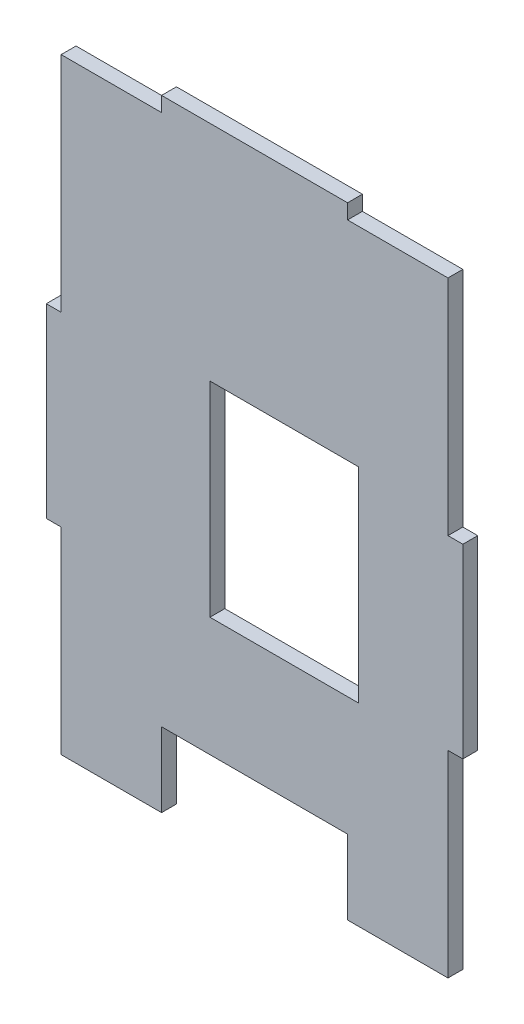
ISO-10303-21;
HEADER;
FILE_DESCRIPTION(('STEP AP214'),'2;1');
FILE_NAME('part.step','',(''),(''),'','','');
FILE_SCHEMA(('AUTOMOTIVE_DESIGN { 1 0 10303 214 1 1 1 1 }'));
ENDSEC;
DATA;
#1=APPLICATION_CONTEXT('core data for automotive mechanical design processes');
#2=APPLICATION_PROTOCOL_DEFINITION('international standard','automotive_design',2000,#1);
#3=PRODUCT_CONTEXT('',#1,'mechanical');
#4=PRODUCT('Part','Part','',(#3));
#5=PRODUCT_RELATED_PRODUCT_CATEGORY('part','',(#4));
#6=PRODUCT_DEFINITION_FORMATION('','',#4);
#7=PRODUCT_DEFINITION_CONTEXT('part definition',#1,'design');
#8=PRODUCT_DEFINITION('design','',#6,#7);
#9=PRODUCT_DEFINITION_SHAPE('','',#8);
#10=(LENGTH_UNIT() NAMED_UNIT(*) SI_UNIT(.MILLI.,.METRE.));
#11=(NAMED_UNIT(*) PLANE_ANGLE_UNIT() SI_UNIT($,.RADIAN.));
#12=(NAMED_UNIT(*) SI_UNIT($,.STERADIAN.) SOLID_ANGLE_UNIT());
#13=UNCERTAINTY_MEASURE_WITH_UNIT(LENGTH_MEASURE(1.E-05),#10,'distance_accuracy_value','');
#14=(GEOMETRIC_REPRESENTATION_CONTEXT(3) GLOBAL_UNCERTAINTY_ASSIGNED_CONTEXT((#13)) GLOBAL_UNIT_ASSIGNED_CONTEXT((#10,
#11,#12)) REPRESENTATION_CONTEXT('',''));
#15=CARTESIAN_POINT('',(0.,0.,0.));
#16=DIRECTION('',(0.,0.,1.));
#17=DIRECTION('',(1.,0.,0.));
#18=AXIS2_PLACEMENT_3D('',#15,#16,#17);
#19=CARTESIAN_POINT('',(108.,-79.9999999999998,-4.));
#20=DIRECTION('',(0.,1.,0.));
#21=DIRECTION('',(-1.,0.,0.));
#22=AXIS2_PLACEMENT_3D('',#19,#20,#21);
#23=PLANE('',#22);
#24=DIRECTION('',(-1.,0.,0.));
#25=VECTOR('',#24,1.);
#26=CARTESIAN_POINT('',(108.,-79.9999999999998,0.));
#27=LINE('',#26,#25);
#28=CARTESIAN_POINT('',(108.,-79.9999999999998,0.));
#29=VERTEX_POINT('',#28);
#30=CARTESIAN_POINT('',(81.0000000000001,-79.9999999999998,0.));
#31=VERTEX_POINT('',#30);
#32=EDGE_CURVE('E270',#29,#31,#27,.T.);
#33=ORIENTED_EDGE('',*,*,#32,.T.);
#34=DIRECTION('',(0.,0.,1.));
#35=VECTOR('',#34,1.);
#36=CARTESIAN_POINT('',(81.0000000000001,-79.9999999999998,-4.));
#37=LINE('',#36,#35);
#38=CARTESIAN_POINT('',(81.0000000000001,-79.9999999999998,-4.));
#39=VERTEX_POINT('',#38);
#40=EDGE_CURVE('E231',#39,#31,#37,.T.);
#41=ORIENTED_EDGE('',*,*,#40,.F.);
#42=DIRECTION('',(-1.,0.,0.));
#43=VECTOR('',#42,1.);
#44=CARTESIAN_POINT('',(108.,-79.9999999999998,-4.));
#45=LINE('',#44,#43);
#46=CARTESIAN_POINT('',(108.,-79.9999999999998,-4.));
#47=VERTEX_POINT('',#46);
#48=EDGE_CURVE('E223',#47,#39,#45,.T.);
#49=ORIENTED_EDGE('',*,*,#48,.F.);
#50=DIRECTION('',(0.,0.,1.));
#51=VECTOR('',#50,1.);
#52=CARTESIAN_POINT('',(108.,-79.9999999999998,-4.));
#53=LINE('',#52,#51);
#54=EDGE_CURVE('E268',#47,#29,#53,.T.);
#55=ORIENTED_EDGE('',*,*,#54,.T.);
#56=EDGE_LOOP('',(#33,#41,#49,#55));
#57=FACE_BOUND('',#56,.T.);
#58=ADVANCED_FACE('F36',(#57),#23,.F.);
#59=CARTESIAN_POINT('',(-3.1069777038326E-13,86.9999999999998,-4.));
#60=DIRECTION('',(0.,1.,0.));
#61=DIRECTION('',(0.,0.,1.));
#62=AXIS2_PLACEMENT_3D('',#59,#60,#61);
#63=PLANE('',#62);
#64=DIRECTION('',(-1.,0.,0.));
#65=VECTOR('',#64,1.);
#66=CARTESIAN_POINT('',(-3.1069777038326E-13,86.9999999999998,-4.));
#67=LINE('',#66,#65);
#68=CARTESIAN_POINT('',(80.9999999999999,86.9999999999998,-4.));
#69=VERTEX_POINT('',#68);
#70=CARTESIAN_POINT('',(30.9999999999999,86.9999999999998,-4.));
#71=VERTEX_POINT('',#70);
#72=EDGE_CURVE('E11',#69,#71,#67,.T.);
#73=ORIENTED_EDGE('',*,*,#72,.T.);
#74=DIRECTION('',(0.,0.,1.));
#75=VECTOR('',#74,1.);
#76=CARTESIAN_POINT('',(30.9999999999999,86.9999999999998,-4.));
#77=LINE('',#76,#75);
#78=CARTESIAN_POINT('',(30.9999999999999,86.9999999999998,0.));
#79=VERTEX_POINT('',#78);
#80=EDGE_CURVE('E278',#71,#79,#77,.T.);
#81=ORIENTED_EDGE('',*,*,#80,.T.);
#82=DIRECTION('',(-1.,0.,0.));
#83=VECTOR('',#82,1.);
#84=CARTESIAN_POINT('',(-3.1069777038326E-13,86.9999999999998,0.));
#85=LINE('',#84,#83);
#86=CARTESIAN_POINT('',(80.9999999999999,86.9999999999998,0.));
#87=VERTEX_POINT('',#86);
#88=EDGE_CURVE('E40',#87,#79,#85,.T.);
#89=ORIENTED_EDGE('',*,*,#88,.F.);
#90=DIRECTION('',(0.,0.,1.));
#91=VECTOR('',#90,1.);
#92=CARTESIAN_POINT('',(80.9999999999999,86.9999999999998,-4.));
#93=LINE('',#92,#91);
#94=EDGE_CURVE('E354',#69,#87,#93,.T.);
#95=ORIENTED_EDGE('',*,*,#94,.F.);
#96=EDGE_LOOP('',(#73,#81,#89,#95));
#97=FACE_BOUND('',#96,.T.);
#98=ADVANCED_FACE('F394',(#97),#63,.T.);
#99=CARTESIAN_POINT('',(112.,86.9999999999998,-4.));
#100=DIRECTION('',(1.,0.,0.));
#101=DIRECTION('',(0.,0.,-1.));
#102=AXIS2_PLACEMENT_3D('',#99,#100,#101);
#103=PLANE('',#102);
#104=DIRECTION('',(0.,1.,0.));
#105=VECTOR('',#104,1.);
#106=CARTESIAN_POINT('',(112.,86.9999999999998,0.));
#107=LINE('',#106,#105);
#108=CARTESIAN_POINT('',(112.,-26.9999999999998,0.));
#109=VERTEX_POINT('',#108);
#110=CARTESIAN_POINT('',(112.,23.0000000000002,0.));
#111=VERTEX_POINT('',#110);
#112=EDGE_CURVE('E382',#109,#111,#107,.T.);
#113=ORIENTED_EDGE('',*,*,#112,.F.);
#114=DIRECTION('',(0.,0.,1.));
#115=VECTOR('',#114,1.);
#116=CARTESIAN_POINT('',(112.,-26.9999999999998,-4.));
#117=LINE('',#116,#115);
#118=CARTESIAN_POINT('',(112.,-26.9999999999998,-4.));
#119=VERTEX_POINT('',#118);
#120=EDGE_CURVE('E276',#119,#109,#117,.T.);
#121=ORIENTED_EDGE('',*,*,#120,.F.);
#122=DIRECTION('',(0.,1.,0.));
#123=VECTOR('',#122,1.);
#124=CARTESIAN_POINT('',(112.,86.9999999999998,-4.));
#125=LINE('',#124,#123);
#126=CARTESIAN_POINT('',(112.,23.0000000000002,-4.));
#127=VERTEX_POINT('',#126);
#128=EDGE_CURVE('E45',#119,#127,#125,.T.);
#129=ORIENTED_EDGE('',*,*,#128,.T.);
#130=DIRECTION('',(0.,0.,1.));
#131=VECTOR('',#130,1.);
#132=CARTESIAN_POINT('',(112.,23.0000000000002,-4.));
#133=LINE('',#132,#131);
#134=EDGE_CURVE('E365',#127,#111,#133,.T.);
#135=ORIENTED_EDGE('',*,*,#134,.T.);
#136=EDGE_LOOP('',(#113,#121,#129,#135));
#137=FACE_BOUND('',#136,.T.);
#138=ADVANCED_FACE('F442',(#137),#103,.T.);
#139=CARTESIAN_POINT('',(0.,0.,-4.));
#140=DIRECTION('',(0.,0.,1.));
#141=DIRECTION('',(1.,0.,0.));
#142=AXIS2_PLACEMENT_3D('',#139,#140,#141);
#143=PLANE('',#142);
#144=ORIENTED_EDGE('',*,*,#48,.T.);
#145=DIRECTION('',(0.,1.,0.));
#146=VECTOR('',#145,1.);
#147=CARTESIAN_POINT('',(81.0000000000001,-79.9999999999998,-4.));
#148=LINE('',#147,#146);
#149=CARTESIAN_POINT('',(81.0000000000001,-59.9999999999998,-4.));
#150=VERTEX_POINT('',#149);
#151=EDGE_CURVE('E202',#39,#150,#148,.T.);
#152=ORIENTED_EDGE('',*,*,#151,.T.);
#153=DIRECTION('',(-1.,0.,0.));
#154=VECTOR('',#153,1.);
#155=CARTESIAN_POINT('',(81.0000000000001,-59.9999999999998,-4.));
#156=LINE('',#155,#154);
#157=CARTESIAN_POINT('',(31.0000000000001,-59.9999999999998,-4.));
#158=VERTEX_POINT('',#157);
#159=EDGE_CURVE('E213',#150,#158,#156,.T.);
#160=ORIENTED_EDGE('',*,*,#159,.T.);
#161=DIRECTION('',(0.,-1.,0.));
#162=VECTOR('',#161,1.);
#163=CARTESIAN_POINT('',(31.0000000000001,-79.9999999999998,-4.));
#164=LINE('',#163,#162);
#165=CARTESIAN_POINT('',(31.0000000000001,-79.9999999999998,-4.));
#166=VERTEX_POINT('',#165);
#167=EDGE_CURVE('E210',#158,#166,#164,.T.);
#168=ORIENTED_EDGE('',*,*,#167,.T.);
#169=CARTESIAN_POINT('',(4.00000000000009,-79.9999999999998,-4.));
#170=VERTEX_POINT('',#169);
#171=EDGE_CURVE('E269',#166,#170,#45,.T.);
#172=ORIENTED_EDGE('',*,*,#171,.T.);
#173=DIRECTION('',(0.,-1.,0.));
#174=VECTOR('',#173,1.);
#175=CARTESIAN_POINT('',(4.00000000000009,0.,-4.));
#176=LINE('',#175,#174);
#177=CARTESIAN_POINT('',(4.00000000000009,-27.0000000000002,-4.));
#178=VERTEX_POINT('',#177);
#179=EDGE_CURVE('E323',#178,#170,#176,.T.);
#180=ORIENTED_EDGE('',*,*,#179,.F.);
#181=DIRECTION('',(-1.,0.,0.));
#182=VECTOR('',#181,1.);
#183=CARTESIAN_POINT('',(0.,-27.0000000000002,-4.));
#184=LINE('',#183,#182);
#185=CARTESIAN_POINT('',(-3.12250225675825E-13,-27.0000000000002,-4.));
#186=VERTEX_POINT('',#185);
#187=EDGE_CURVE('E316',#178,#186,#184,.T.);
#188=ORIENTED_EDGE('',*,*,#187,.T.);
#189=DIRECTION('',(0.,-1.,0.));
#190=VECTOR('',#189,1.);
#191=CARTESIAN_POINT('',(-3.1069777038326E-13,86.9999999999998,-4.));
#192=LINE('',#191,#190);
#193=CARTESIAN_POINT('',(-3.12250225675825E-13,22.9999999999998,-4.));
#194=VERTEX_POINT('',#193);
#195=EDGE_CURVE('E376',#194,#186,#192,.T.);
#196=ORIENTED_EDGE('',*,*,#195,.F.);
#197=DIRECTION('',(1.,0.,0.));
#198=VECTOR('',#197,1.);
#199=CARTESIAN_POINT('',(0.,22.9999999999998,-4.));
#200=LINE('',#199,#198);
#201=CARTESIAN_POINT('',(3.99999999999991,22.9999999999998,-4.));
#202=VERTEX_POINT('',#201);
#203=EDGE_CURVE('E309',#194,#202,#200,.T.);
#204=ORIENTED_EDGE('',*,*,#203,.T.);
#205=DIRECTION('',(0.,-1.,0.));
#206=VECTOR('',#205,1.);
#207=CARTESIAN_POINT('',(3.99999999999991,0.,-4.));
#208=LINE('',#207,#206);
#209=CARTESIAN_POINT('',(3.99999999999991,82.9999999999998,-4.));
#210=VERTEX_POINT('',#209);
#211=EDGE_CURVE('E307',#210,#202,#208,.T.);
#212=ORIENTED_EDGE('',*,*,#211,.F.);
#213=DIRECTION('',(1.,0.,0.));
#214=VECTOR('',#213,1.);
#215=CARTESIAN_POINT('',(0.,82.9999999999998,-4.));
#216=LINE('',#215,#214);
#217=CARTESIAN_POINT('',(30.9999999999999,82.9999999999998,-4.));
#218=VERTEX_POINT('',#217);
#219=EDGE_CURVE('E281',#210,#218,#216,.T.);
#220=ORIENTED_EDGE('',*,*,#219,.T.);
#221=DIRECTION('',(0.,-1.,0.));
#222=VECTOR('',#221,1.);
#223=CARTESIAN_POINT('',(30.9999999999998,0.,-4.));
#224=LINE('',#223,#222);
#225=EDGE_CURVE('E295',#71,#218,#224,.T.);
#226=ORIENTED_EDGE('',*,*,#225,.F.);
#227=ORIENTED_EDGE('',*,*,#72,.F.);
#228=DIRECTION('',(0.,-1.,0.));
#229=VECTOR('',#228,1.);
#230=CARTESIAN_POINT('',(80.9999999999999,0.,-4.));
#231=LINE('',#230,#229);
#232=CARTESIAN_POINT('',(80.9999999999999,82.9999999999998,-4.));
#233=VERTEX_POINT('',#232);
#234=EDGE_CURVE('E343',#69,#233,#231,.T.);
#235=ORIENTED_EDGE('',*,*,#234,.T.);
#236=DIRECTION('',(-1.,0.,0.));
#237=VECTOR('',#236,1.);
#238=CARTESIAN_POINT('',(0.,82.9999999999998,-4.));
#239=LINE('',#238,#237);
#240=CARTESIAN_POINT('',(108.,82.9999999999998,-4.));
#241=VERTEX_POINT('',#240);
#242=EDGE_CURVE('E346',#241,#233,#239,.T.);
#243=ORIENTED_EDGE('',*,*,#242,.F.);
#244=DIRECTION('',(0.,-1.,0.));
#245=VECTOR('',#244,1.);
#246=CARTESIAN_POINT('',(108.,0.,-4.));
#247=LINE('',#246,#245);
#248=CARTESIAN_POINT('',(108.,23.0000000000002,-4.));
#249=VERTEX_POINT('',#248);
#250=EDGE_CURVE('E349',#241,#249,#247,.T.);
#251=ORIENTED_EDGE('',*,*,#250,.T.);
#252=DIRECTION('',(-1.,0.,0.));
#253=VECTOR('',#252,1.);
#254=CARTESIAN_POINT('',(0.,23.0000000000002,-4.));
#255=LINE('',#254,#253);
#256=EDGE_CURVE('E352',#127,#249,#255,.T.);
#257=ORIENTED_EDGE('',*,*,#256,.F.);
#258=ORIENTED_EDGE('',*,*,#128,.F.);
#259=DIRECTION('',(1.,0.,0.));
#260=VECTOR('',#259,1.);
#261=CARTESIAN_POINT('',(108.,-26.9999999999998,-4.));
#262=LINE('',#261,#260);
#263=CARTESIAN_POINT('',(108.,-26.9999999999998,-4.));
#264=VERTEX_POINT('',#263);
#265=EDGE_CURVE('E338',#264,#119,#262,.T.);
#266=ORIENTED_EDGE('',*,*,#265,.F.);
#267=DIRECTION('',(0.,-1.,0.));
#268=VECTOR('',#267,1.);
#269=CARTESIAN_POINT('',(108.,-26.9999999999998,-4.));
#270=LINE('',#269,#268);
#271=EDGE_CURVE('E334',#264,#47,#270,.T.);
#272=ORIENTED_EDGE('',*,*,#271,.T.);
#273=EDGE_LOOP('',(#144,#152,#160,#168,#172,#180,#188,#196,#204,#212,#220,#226,#227,#235,#243,
#251,#257,#258,#266,#272));
#274=FACE_BOUND('',#273,.T.);
#275=DIRECTION('',(-1.,0.,0.));
#276=VECTOR('',#275,1.);
#277=CARTESIAN_POINT('',(44.0000000000003,26.9999999999998,-4.));
#278=LINE('',#277,#276);
#279=CARTESIAN_POINT('',(84.0000000000003,26.9999999999998,-4.));
#280=VERTEX_POINT('',#279);
#281=CARTESIAN_POINT('',(44.0000000000003,26.9999999999998,-4.));
#282=VERTEX_POINT('',#281);
#283=EDGE_CURVE('E245',#280,#282,#278,.T.);
#284=ORIENTED_EDGE('',*,*,#283,.T.);
#285=DIRECTION('',(0.,-1.,0.));
#286=VECTOR('',#285,1.);
#287=CARTESIAN_POINT('',(44.0000000000003,26.9999999999998,-4.));
#288=LINE('',#287,#286);
#289=CARTESIAN_POINT('',(44.0000000000003,-28.0000000000002,-4.));
#290=VERTEX_POINT('',#289);
#291=EDGE_CURVE('E237',#282,#290,#288,.T.);
#292=ORIENTED_EDGE('',*,*,#291,.T.);
#293=DIRECTION('',(1.,0.,0.));
#294=VECTOR('',#293,1.);
#295=CARTESIAN_POINT('',(44.0000000000003,-28.0000000000002,-4.));
#296=LINE('',#295,#294);
#297=CARTESIAN_POINT('',(84.0000000000003,-28.0000000000002,-4.));
#298=VERTEX_POINT('',#297);
#299=EDGE_CURVE('E240',#290,#298,#296,.T.);
#300=ORIENTED_EDGE('',*,*,#299,.T.);
#301=DIRECTION('',(0.,1.,0.));
#302=VECTOR('',#301,1.);
#303=CARTESIAN_POINT('',(84.0000000000003,26.9999999999998,-4.));
#304=LINE('',#303,#302);
#305=EDGE_CURVE('E61',#298,#280,#304,.T.);
#306=ORIENTED_EDGE('',*,*,#305,.T.);
#307=EDGE_LOOP('',(#284,#292,#300,#306));
#308=FACE_BOUND('',#307,.T.);
#309=ADVANCED_FACE('F220',(#274,#308),#143,.F.);
#310=CARTESIAN_POINT('',(0.,0.,0.));
#311=DIRECTION('',(0.,0.,1.));
#312=DIRECTION('',(1.,0.,0.));
#313=AXIS2_PLACEMENT_3D('',#310,#311,#312);
#314=PLANE('',#313);
#315=DIRECTION('',(0.,1.,0.));
#316=VECTOR('',#315,1.);
#317=CARTESIAN_POINT('',(81.0000000000001,-79.9999999999998,0.));
#318=LINE('',#317,#316);
#319=CARTESIAN_POINT('',(81.0000000000001,-59.9999999999998,0.));
#320=VERTEX_POINT('',#319);
#321=EDGE_CURVE('E205',#31,#320,#318,.T.);
#322=ORIENTED_EDGE('',*,*,#321,.F.);
#323=ORIENTED_EDGE('',*,*,#32,.F.);
#324=DIRECTION('',(0.,-1.,0.));
#325=VECTOR('',#324,1.);
#326=CARTESIAN_POINT('',(108.,-26.9999999999998,0.));
#327=LINE('',#326,#325);
#328=CARTESIAN_POINT('',(108.,-26.9999999999998,0.));
#329=VERTEX_POINT('',#328);
#330=EDGE_CURVE('E335',#329,#29,#327,.T.);
#331=ORIENTED_EDGE('',*,*,#330,.F.);
#332=DIRECTION('',(1.,0.,0.));
#333=VECTOR('',#332,1.);
#334=CARTESIAN_POINT('',(108.,-26.9999999999998,0.));
#335=LINE('',#334,#333);
#336=EDGE_CURVE('E320',#329,#109,#335,.T.);
#337=ORIENTED_EDGE('',*,*,#336,.T.);
#338=ORIENTED_EDGE('',*,*,#112,.T.);
#339=DIRECTION('',(-1.,0.,0.));
#340=VECTOR('',#339,1.);
#341=CARTESIAN_POINT('',(0.,23.0000000000002,0.));
#342=LINE('',#341,#340);
#343=CARTESIAN_POINT('',(108.,23.0000000000002,0.));
#344=VERTEX_POINT('',#343);
#345=EDGE_CURVE('E347',#111,#344,#342,.T.);
#346=ORIENTED_EDGE('',*,*,#345,.T.);
#347=DIRECTION('',(0.,-1.,0.));
#348=VECTOR('',#347,1.);
#349=CARTESIAN_POINT('',(108.,0.,0.));
#350=LINE('',#349,#348);
#351=CARTESIAN_POINT('',(108.,82.9999999999998,0.));
#352=VERTEX_POINT('',#351);
#353=EDGE_CURVE('E360',#352,#344,#350,.T.);
#354=ORIENTED_EDGE('',*,*,#353,.F.);
#355=DIRECTION('',(-1.,0.,0.));
#356=VECTOR('',#355,1.);
#357=CARTESIAN_POINT('',(0.,82.9999999999998,0.));
#358=LINE('',#357,#356);
#359=CARTESIAN_POINT('',(80.9999999999999,82.9999999999998,0.));
#360=VERTEX_POINT('',#359);
#361=EDGE_CURVE('E357',#352,#360,#358,.T.);
#362=ORIENTED_EDGE('',*,*,#361,.T.);
#363=DIRECTION('',(0.,-1.,0.));
#364=VECTOR('',#363,1.);
#365=CARTESIAN_POINT('',(80.9999999999999,0.,0.));
#366=LINE('',#365,#364);
#367=EDGE_CURVE('E304',#87,#360,#366,.T.);
#368=ORIENTED_EDGE('',*,*,#367,.F.);
#369=ORIENTED_EDGE('',*,*,#88,.T.);
#370=DIRECTION('',(0.,-1.,0.));
#371=VECTOR('',#370,1.);
#372=CARTESIAN_POINT('',(30.9999999999998,0.,0.));
#373=LINE('',#372,#371);
#374=CARTESIAN_POINT('',(30.9999999999999,82.9999999999998,0.));
#375=VERTEX_POINT('',#374);
#376=EDGE_CURVE('E301',#79,#375,#373,.T.);
#377=ORIENTED_EDGE('',*,*,#376,.T.);
#378=DIRECTION('',(1.,0.,0.));
#379=VECTOR('',#378,1.);
#380=CARTESIAN_POINT('',(0.,82.9999999999998,0.));
#381=LINE('',#380,#379);
#382=CARTESIAN_POINT('',(3.99999999999991,82.9999999999998,0.));
#383=VERTEX_POINT('',#382);
#384=EDGE_CURVE('E291',#383,#375,#381,.T.);
#385=ORIENTED_EDGE('',*,*,#384,.F.);
#386=DIRECTION('',(0.,-1.,0.));
#387=VECTOR('',#386,1.);
#388=CARTESIAN_POINT('',(3.99999999999991,0.,0.));
#389=LINE('',#388,#387);
#390=CARTESIAN_POINT('',(3.99999999999991,22.9999999999998,0.));
#391=VERTEX_POINT('',#390);
#392=EDGE_CURVE('E294',#383,#391,#389,.T.);
#393=ORIENTED_EDGE('',*,*,#392,.T.);
#394=DIRECTION('',(1.,0.,0.));
#395=VECTOR('',#394,1.);
#396=CARTESIAN_POINT('',(0.,22.9999999999998,0.));
#397=LINE('',#396,#395);
#398=CARTESIAN_POINT('',(-3.1069777038326E-13,22.9999999999998,0.));
#399=VERTEX_POINT('',#398);
#400=EDGE_CURVE('E298',#399,#391,#397,.T.);
#401=ORIENTED_EDGE('',*,*,#400,.F.);
#402=DIRECTION('',(0.,-1.,0.));
#403=VECTOR('',#402,1.);
#404=CARTESIAN_POINT('',(-3.1069777038326E-13,86.9999999999998,0.));
#405=LINE('',#404,#403);
#406=CARTESIAN_POINT('',(-3.12250225675825E-13,-27.0000000000002,0.));
#407=VERTEX_POINT('',#406);
#408=EDGE_CURVE('E368',#399,#407,#405,.T.);
#409=ORIENTED_EDGE('',*,*,#408,.T.);
#410=DIRECTION('',(-1.,0.,0.));
#411=VECTOR('',#410,1.);
#412=CARTESIAN_POINT('',(0.,-27.0000000000002,0.));
#413=LINE('',#412,#411);
#414=CARTESIAN_POINT('',(4.00000000000009,-27.0000000000002,0.));
#415=VERTEX_POINT('',#414);
#416=EDGE_CURVE('E321',#415,#407,#413,.T.);
#417=ORIENTED_EDGE('',*,*,#416,.F.);
#418=DIRECTION('',(0.,-1.,0.));
#419=VECTOR('',#418,1.);
#420=CARTESIAN_POINT('',(4.00000000000009,0.,0.));
#421=LINE('',#420,#419);
#422=CARTESIAN_POINT('',(4.00000000000009,-79.9999999999998,0.));
#423=VERTEX_POINT('',#422);
#424=EDGE_CURVE('E290',#415,#423,#421,.T.);
#425=ORIENTED_EDGE('',*,*,#424,.T.);
#426=CARTESIAN_POINT('',(31.0000000000001,-79.9999999999998,0.));
#427=VERTEX_POINT('',#426);
#428=EDGE_CURVE('E260',#427,#423,#27,.T.);
#429=ORIENTED_EDGE('',*,*,#428,.F.);
#430=DIRECTION('',(0.,-1.,0.));
#431=VECTOR('',#430,1.);
#432=CARTESIAN_POINT('',(31.0000000000001,-79.9999999999998,0.));
#433=LINE('',#432,#431);
#434=CARTESIAN_POINT('',(31.0000000000001,-59.9999999999998,0.));
#435=VERTEX_POINT('',#434);
#436=EDGE_CURVE('E53',#435,#427,#433,.T.);
#437=ORIENTED_EDGE('',*,*,#436,.F.);
#438=DIRECTION('',(-1.,0.,0.));
#439=VECTOR('',#438,1.);
#440=CARTESIAN_POINT('',(81.0000000000001,-59.9999999999998,0.));
#441=LINE('',#440,#439);
#442=EDGE_CURVE('E225',#320,#435,#441,.T.);
#443=ORIENTED_EDGE('',*,*,#442,.F.);
#444=EDGE_LOOP('',(#322,#323,#331,#337,#338,#346,#354,#362,#368,#369,#377,#385,#393,#401,#409,
#417,#425,#429,#437,#443));
#445=FACE_BOUND('',#444,.T.);
#446=DIRECTION('',(0.,-1.,0.));
#447=VECTOR('',#446,1.);
#448=CARTESIAN_POINT('',(44.0000000000003,26.9999999999998,0.));
#449=LINE('',#448,#447);
#450=CARTESIAN_POINT('',(44.0000000000003,26.9999999999998,0.));
#451=VERTEX_POINT('',#450);
#452=CARTESIAN_POINT('',(44.0000000000003,-28.0000000000002,0.));
#453=VERTEX_POINT('',#452);
#454=EDGE_CURVE('E233',#451,#453,#449,.T.);
#455=ORIENTED_EDGE('',*,*,#454,.F.);
#456=DIRECTION('',(-1.,0.,0.));
#457=VECTOR('',#456,1.);
#458=CARTESIAN_POINT('',(44.0000000000003,26.9999999999998,0.));
#459=LINE('',#458,#457);
#460=CARTESIAN_POINT('',(84.0000000000003,26.9999999999998,0.));
#461=VERTEX_POINT('',#460);
#462=EDGE_CURVE('E241',#461,#451,#459,.T.);
#463=ORIENTED_EDGE('',*,*,#462,.F.);
#464=DIRECTION('',(0.,1.,0.));
#465=VECTOR('',#464,1.);
#466=CARTESIAN_POINT('',(84.0000000000003,26.9999999999998,0.));
#467=LINE('',#466,#465);
#468=CARTESIAN_POINT('',(84.0000000000003,-28.0000000000002,0.));
#469=VERTEX_POINT('',#468);
#470=EDGE_CURVE('E253',#469,#461,#467,.T.);
#471=ORIENTED_EDGE('',*,*,#470,.F.);
#472=DIRECTION('',(1.,0.,0.));
#473=VECTOR('',#472,1.);
#474=CARTESIAN_POINT('',(44.0000000000003,-28.0000000000002,0.));
#475=LINE('',#474,#473);
#476=EDGE_CURVE('E250',#453,#469,#475,.T.);
#477=ORIENTED_EDGE('',*,*,#476,.F.);
#478=EDGE_LOOP('',(#455,#463,#471,#477));
#479=FACE_BOUND('',#478,.T.);
#480=ADVANCED_FACE('F389',(#445,#479),#314,.T.);
#481=CARTESIAN_POINT('',(-3.1069777038326E-13,86.9999999999998,-4.));
#482=DIRECTION('',(-1.,0.,0.));
#483=DIRECTION('',(0.,0.,1.));
#484=AXIS2_PLACEMENT_3D('',#481,#482,#483);
#485=PLANE('',#484);
#486=DIRECTION('',(0.,0.,1.));
#487=VECTOR('',#486,1.);
#488=CARTESIAN_POINT('',(-3.12250225675825E-13,-27.0000000000002,-4.));
#489=LINE('',#488,#487);
#490=EDGE_CURVE('E317',#186,#407,#489,.T.);
#491=ORIENTED_EDGE('',*,*,#490,.T.);
#492=ORIENTED_EDGE('',*,*,#408,.F.);
#493=DIRECTION('',(0.,0.,1.));
#494=VECTOR('',#493,1.);
#495=CARTESIAN_POINT('',(-3.12250225675825E-13,22.9999999999998,-4.));
#496=LINE('',#495,#494);
#497=EDGE_CURVE('E282',#194,#399,#496,.T.);
#498=ORIENTED_EDGE('',*,*,#497,.F.);
#499=ORIENTED_EDGE('',*,*,#195,.T.);
#500=EDGE_LOOP('',(#491,#492,#498,#499));
#501=FACE_BOUND('',#500,.T.);
#502=ADVANCED_FACE('F38',(#501),#485,.T.);
#503=CARTESIAN_POINT('',(0.,23.0000000000002,-4.));
#504=DIRECTION('',(0.,1.,0.));
#505=DIRECTION('',(0.,0.,1.));
#506=AXIS2_PLACEMENT_3D('',#503,#504,#505);
#507=PLANE('',#506);
#508=ORIENTED_EDGE('',*,*,#345,.F.);
#509=ORIENTED_EDGE('',*,*,#134,.F.);
#510=ORIENTED_EDGE('',*,*,#256,.T.);
#511=DIRECTION('',(0.,0.,1.));
#512=VECTOR('',#511,1.);
#513=CARTESIAN_POINT('',(108.,23.0000000000002,-4.));
#514=LINE('',#513,#512);
#515=EDGE_CURVE('E369',#249,#344,#514,.T.);
#516=ORIENTED_EDGE('',*,*,#515,.T.);
#517=EDGE_LOOP('',(#508,#509,#510,#516));
#518=FACE_BOUND('',#517,.T.);
#519=ADVANCED_FACE('F444',(#518),#507,.T.);
#520=CARTESIAN_POINT('',(108.,0.,-4.));
#521=DIRECTION('',(-1.,0.,0.));
#522=DIRECTION('',(0.,0.,1.));
#523=AXIS2_PLACEMENT_3D('',#520,#521,#522);
#524=PLANE('',#523);
#525=ORIENTED_EDGE('',*,*,#353,.T.);
#526=ORIENTED_EDGE('',*,*,#515,.F.);
#527=ORIENTED_EDGE('',*,*,#250,.F.);
#528=DIRECTION('',(0.,0.,1.));
#529=VECTOR('',#528,1.);
#530=CARTESIAN_POINT('',(108.,82.9999999999998,-4.));
#531=LINE('',#530,#529);
#532=EDGE_CURVE('E371',#241,#352,#531,.T.);
#533=ORIENTED_EDGE('',*,*,#532,.T.);
#534=EDGE_LOOP('',(#525,#526,#527,#533));
#535=FACE_BOUND('',#534,.T.);
#536=ADVANCED_FACE('F449',(#535),#524,.F.);
#537=CARTESIAN_POINT('',(0.,82.9999999999998,-4.));
#538=DIRECTION('',(0.,1.,0.));
#539=DIRECTION('',(0.,0.,1.));
#540=AXIS2_PLACEMENT_3D('',#537,#538,#539);
#541=PLANE('',#540);
#542=ORIENTED_EDGE('',*,*,#361,.F.);
#543=ORIENTED_EDGE('',*,*,#532,.F.);
#544=ORIENTED_EDGE('',*,*,#242,.T.);
#545=DIRECTION('',(0.,0.,1.));
#546=VECTOR('',#545,1.);
#547=CARTESIAN_POINT('',(80.9999999999999,82.9999999999998,-4.));
#548=LINE('',#547,#546);
#549=EDGE_CURVE('E373',#233,#360,#548,.T.);
#550=ORIENTED_EDGE('',*,*,#549,.T.);
#551=EDGE_LOOP('',(#542,#543,#544,#550));
#552=FACE_BOUND('',#551,.T.);
#553=ADVANCED_FACE('F453',(#552),#541,.T.);
#554=CARTESIAN_POINT('',(80.9999999999999,0.,-4.));
#555=DIRECTION('',(-1.,0.,0.));
#556=DIRECTION('',(0.,0.,1.));
#557=AXIS2_PLACEMENT_3D('',#554,#555,#556);
#558=PLANE('',#557);
#559=ORIENTED_EDGE('',*,*,#367,.T.);
#560=ORIENTED_EDGE('',*,*,#549,.F.);
#561=ORIENTED_EDGE('',*,*,#234,.F.);
#562=ORIENTED_EDGE('',*,*,#94,.T.);
#563=EDGE_LOOP('',(#559,#560,#561,#562));
#564=FACE_BOUND('',#563,.T.);
#565=ADVANCED_FACE('F456',(#564),#558,.F.);
#566=CARTESIAN_POINT('',(30.9999999999998,0.,-4.));
#567=DIRECTION('',(-1.,0.,0.));
#568=DIRECTION('',(0.,-1.,0.));
#569=AXIS2_PLACEMENT_3D('',#566,#567,#568);
#570=PLANE('',#569);
#571=ORIENTED_EDGE('',*,*,#376,.F.);
#572=ORIENTED_EDGE('',*,*,#80,.F.);
#573=ORIENTED_EDGE('',*,*,#225,.T.);
#574=DIRECTION('',(0.,0.,1.));
#575=VECTOR('',#574,1.);
#576=CARTESIAN_POINT('',(30.9999999999999,82.9999999999998,-4.));
#577=LINE('',#576,#575);
#578=EDGE_CURVE('E288',#218,#375,#577,.T.);
#579=ORIENTED_EDGE('',*,*,#578,.T.);
#580=EDGE_LOOP('',(#571,#572,#573,#579));
#581=FACE_BOUND('',#580,.T.);
#582=ADVANCED_FACE('F398',(#581),#570,.T.);
#583=CARTESIAN_POINT('',(0.,82.9999999999998,-4.));
#584=DIRECTION('',(0.,-1.,0.));
#585=DIRECTION('',(0.,0.,-1.));
#586=AXIS2_PLACEMENT_3D('',#583,#584,#585);
#587=PLANE('',#586);
#588=ORIENTED_EDGE('',*,*,#384,.T.);
#589=ORIENTED_EDGE('',*,*,#578,.F.);
#590=ORIENTED_EDGE('',*,*,#219,.F.);
#591=DIRECTION('',(0.,0.,1.));
#592=VECTOR('',#591,1.);
#593=CARTESIAN_POINT('',(3.99999999999991,82.9999999999998,-4.));
#594=LINE('',#593,#592);
#595=EDGE_CURVE('E286',#210,#383,#594,.T.);
#596=ORIENTED_EDGE('',*,*,#595,.T.);
#597=EDGE_LOOP('',(#588,#589,#590,#596));
#598=FACE_BOUND('',#597,.T.);
#599=ADVANCED_FACE('F403',(#598),#587,.F.);
#600=CARTESIAN_POINT('',(3.99999999999991,0.,-4.));
#601=DIRECTION('',(-1.,0.,0.));
#602=DIRECTION('',(0.,0.,1.));
#603=AXIS2_PLACEMENT_3D('',#600,#601,#602);
#604=PLANE('',#603);
#605=ORIENTED_EDGE('',*,*,#392,.F.);
#606=ORIENTED_EDGE('',*,*,#595,.F.);
#607=ORIENTED_EDGE('',*,*,#211,.T.);
#608=DIRECTION('',(0.,0.,1.));
#609=VECTOR('',#608,1.);
#610=CARTESIAN_POINT('',(3.99999999999991,22.9999999999998,-4.));
#611=LINE('',#610,#609);
#612=EDGE_CURVE('E284',#202,#391,#611,.T.);
#613=ORIENTED_EDGE('',*,*,#612,.T.);
#614=EDGE_LOOP('',(#605,#606,#607,#613));
#615=FACE_BOUND('',#614,.T.);
#616=ADVANCED_FACE('F408',(#615),#604,.T.);
#617=CARTESIAN_POINT('',(0.,22.9999999999998,-4.));
#618=DIRECTION('',(0.,-1.,0.));
#619=DIRECTION('',(0.,0.,-1.));
#620=AXIS2_PLACEMENT_3D('',#617,#618,#619);
#621=PLANE('',#620);
#622=ORIENTED_EDGE('',*,*,#400,.T.);
#623=ORIENTED_EDGE('',*,*,#612,.F.);
#624=ORIENTED_EDGE('',*,*,#203,.F.);
#625=ORIENTED_EDGE('',*,*,#497,.T.);
#626=EDGE_LOOP('',(#622,#623,#624,#625));
#627=FACE_BOUND('',#626,.T.);
#628=ADVANCED_FACE('F411',(#627),#621,.F.);
#629=CARTESIAN_POINT('',(4.00000000000009,0.,-4.));
#630=DIRECTION('',(-1.,0.,0.));
#631=DIRECTION('',(0.,0.,1.));
#632=AXIS2_PLACEMENT_3D('',#629,#630,#631);
#633=PLANE('',#632);
#634=DIRECTION('',(0.,0.,1.));
#635=VECTOR('',#634,1.);
#636=CARTESIAN_POINT('',(4.00000000000009,-79.9999999999998,-4.));
#637=LINE('',#636,#635);
#638=EDGE_CURVE('E273',#170,#423,#637,.T.);
#639=ORIENTED_EDGE('',*,*,#638,.T.);
#640=ORIENTED_EDGE('',*,*,#424,.F.);
#641=DIRECTION('',(0.,0.,1.));
#642=VECTOR('',#641,1.);
#643=CARTESIAN_POINT('',(4.00000000000009,-27.0000000000002,-4.));
#644=LINE('',#643,#642);
#645=EDGE_CURVE('E313',#178,#415,#644,.T.);
#646=ORIENTED_EDGE('',*,*,#645,.F.);
#647=ORIENTED_EDGE('',*,*,#179,.T.);
#648=EDGE_LOOP('',(#639,#640,#646,#647));
#649=FACE_BOUND('',#648,.T.);
#650=ADVANCED_FACE('F422',(#649),#633,.T.);
#651=CARTESIAN_POINT('',(0.,-27.0000000000002,-4.));
#652=DIRECTION('',(0.,1.,0.));
#653=DIRECTION('',(0.,0.,1.));
#654=AXIS2_PLACEMENT_3D('',#651,#652,#653);
#655=PLANE('',#654);
#656=ORIENTED_EDGE('',*,*,#416,.T.);
#657=ORIENTED_EDGE('',*,*,#490,.F.);
#658=ORIENTED_EDGE('',*,*,#187,.F.);
#659=ORIENTED_EDGE('',*,*,#645,.T.);
#660=EDGE_LOOP('',(#656,#657,#658,#659));
#661=FACE_BOUND('',#660,.T.);
#662=ADVANCED_FACE('F418',(#661),#655,.F.);
#663=CARTESIAN_POINT('',(108.,-26.9999999999998,-4.));
#664=DIRECTION('',(0.,-1.,0.));
#665=DIRECTION('',(0.,0.,-1.));
#666=AXIS2_PLACEMENT_3D('',#663,#664,#665);
#667=PLANE('',#666);
#668=ORIENTED_EDGE('',*,*,#336,.F.);
#669=DIRECTION('',(0.,0.,1.));
#670=VECTOR('',#669,1.);
#671=CARTESIAN_POINT('',(108.,-26.9999999999998,-4.));
#672=LINE('',#671,#670);
#673=EDGE_CURVE('E331',#264,#329,#672,.T.);
#674=ORIENTED_EDGE('',*,*,#673,.F.);
#675=ORIENTED_EDGE('',*,*,#265,.T.);
#676=ORIENTED_EDGE('',*,*,#120,.T.);
#677=EDGE_LOOP('',(#668,#674,#675,#676));
#678=FACE_BOUND('',#677,.T.);
#679=ADVANCED_FACE('F440',(#678),#667,.T.);
#680=CARTESIAN_POINT('',(108.,-26.9999999999998,-4.));
#681=DIRECTION('',(-1.,0.,0.));
#682=DIRECTION('',(0.,0.,1.));
#683=AXIS2_PLACEMENT_3D('',#680,#681,#682);
#684=PLANE('',#683);
#685=ORIENTED_EDGE('',*,*,#330,.T.);
#686=ORIENTED_EDGE('',*,*,#54,.F.);
#687=ORIENTED_EDGE('',*,*,#271,.F.);
#688=ORIENTED_EDGE('',*,*,#673,.T.);
#689=EDGE_LOOP('',(#685,#686,#687,#688));
#690=FACE_BOUND('',#689,.T.);
#691=ADVANCED_FACE('F434',(#690),#684,.F.);
#692=ORIENTED_EDGE('',*,*,#171,.F.);
#693=DIRECTION('',(0.,0.,1.));
#694=VECTOR('',#693,1.);
#695=CARTESIAN_POINT('',(31.0000000000001,-79.9999999999998,-4.));
#696=LINE('',#695,#694);
#697=EDGE_CURVE('E234',#166,#427,#696,.T.);
#698=ORIENTED_EDGE('',*,*,#697,.T.);
#699=ORIENTED_EDGE('',*,*,#428,.T.);
#700=ORIENTED_EDGE('',*,*,#638,.F.);
#701=EDGE_LOOP('',(#692,#698,#699,#700));
#702=FACE_BOUND('',#701,.T.);
#703=ADVANCED_FACE('F426',(#702),#23,.F.);
#704=CARTESIAN_POINT('',(44.0000000000003,26.9999999999998,-4.));
#705=DIRECTION('',(-1.,0.,0.));
#706=DIRECTION('',(0.,-1.,0.));
#707=AXIS2_PLACEMENT_3D('',#704,#705,#706);
#708=PLANE('',#707);
#709=ORIENTED_EDGE('',*,*,#454,.T.);
#710=DIRECTION('',(0.,0.,1.));
#711=VECTOR('',#710,1.);
#712=CARTESIAN_POINT('',(44.0000000000003,-28.0000000000002,-4.));
#713=LINE('',#712,#711);
#714=EDGE_CURVE('E248',#290,#453,#713,.T.);
#715=ORIENTED_EDGE('',*,*,#714,.F.);
#716=ORIENTED_EDGE('',*,*,#291,.F.);
#717=DIRECTION('',(0.,0.,1.));
#718=VECTOR('',#717,1.);
#719=CARTESIAN_POINT('',(44.0000000000003,26.9999999999998,-4.));
#720=LINE('',#719,#718);
#721=EDGE_CURVE('E258',#282,#451,#720,.T.);
#722=ORIENTED_EDGE('',*,*,#721,.T.);
#723=EDGE_LOOP('',(#709,#715,#716,#722));
#724=FACE_BOUND('',#723,.T.);
#725=ADVANCED_FACE('F474',(#724),#708,.F.);
#726=CARTESIAN_POINT('',(44.0000000000003,26.9999999999998,-4.));
#727=DIRECTION('',(0.,1.,0.));
#728=DIRECTION('',(0.,0.,1.));
#729=AXIS2_PLACEMENT_3D('',#726,#727,#728);
#730=PLANE('',#729);
#731=ORIENTED_EDGE('',*,*,#462,.T.);
#732=ORIENTED_EDGE('',*,*,#721,.F.);
#733=ORIENTED_EDGE('',*,*,#283,.F.);
#734=DIRECTION('',(0.,0.,1.));
#735=VECTOR('',#734,1.);
#736=CARTESIAN_POINT('',(84.0000000000003,26.9999999999998,-4.));
#737=LINE('',#736,#735);
#738=EDGE_CURVE('E261',#280,#461,#737,.T.);
#739=ORIENTED_EDGE('',*,*,#738,.T.);
#740=EDGE_LOOP('',(#731,#732,#733,#739));
#741=FACE_BOUND('',#740,.T.);
#742=ADVANCED_FACE('F479',(#741),#730,.F.);
#743=CARTESIAN_POINT('',(84.0000000000003,26.9999999999998,-4.));
#744=DIRECTION('',(1.,0.,0.));
#745=DIRECTION('',(0.,0.,-1.));
#746=AXIS2_PLACEMENT_3D('',#743,#744,#745);
#747=PLANE('',#746);
#748=ORIENTED_EDGE('',*,*,#470,.T.);
#749=ORIENTED_EDGE('',*,*,#738,.F.);
#750=ORIENTED_EDGE('',*,*,#305,.F.);
#751=DIRECTION('',(0.,0.,1.));
#752=VECTOR('',#751,1.);
#753=CARTESIAN_POINT('',(84.0000000000003,-28.0000000000002,-4.));
#754=LINE('',#753,#752);
#755=EDGE_CURVE('E263',#298,#469,#754,.T.);
#756=ORIENTED_EDGE('',*,*,#755,.T.);
#757=EDGE_LOOP('',(#748,#749,#750,#756));
#758=FACE_BOUND('',#757,.T.);
#759=ADVANCED_FACE('F586',(#758),#747,.F.);
#760=CARTESIAN_POINT('',(44.0000000000003,-28.0000000000002,-4.));
#761=DIRECTION('',(0.,-1.,0.));
#762=DIRECTION('',(0.,0.,-1.));
#763=AXIS2_PLACEMENT_3D('',#760,#761,#762);
#764=PLANE('',#763);
#765=ORIENTED_EDGE('',*,*,#476,.T.);
#766=ORIENTED_EDGE('',*,*,#755,.F.);
#767=ORIENTED_EDGE('',*,*,#299,.F.);
#768=ORIENTED_EDGE('',*,*,#714,.T.);
#769=EDGE_LOOP('',(#765,#766,#767,#768));
#770=FACE_BOUND('',#769,.T.);
#771=ADVANCED_FACE('F597',(#770),#764,.F.);
#772=CARTESIAN_POINT('',(81.0000000000001,-79.9999999999998,-4.));
#773=DIRECTION('',(1.,0.,0.));
#774=DIRECTION('',(0.,0.,-1.));
#775=AXIS2_PLACEMENT_3D('',#772,#773,#774);
#776=PLANE('',#775);
#777=ORIENTED_EDGE('',*,*,#321,.T.);
#778=DIRECTION('',(0.,0.,1.));
#779=VECTOR('',#778,1.);
#780=CARTESIAN_POINT('',(81.0000000000001,-59.9999999999998,-4.));
#781=LINE('',#780,#779);
#782=EDGE_CURVE('E198',#150,#320,#781,.T.);
#783=ORIENTED_EDGE('',*,*,#782,.F.);
#784=ORIENTED_EDGE('',*,*,#151,.F.);
#785=ORIENTED_EDGE('',*,*,#40,.T.);
#786=EDGE_LOOP('',(#777,#783,#784,#785));
#787=FACE_BOUND('',#786,.T.);
#788=ADVANCED_FACE('F200',(#787),#776,.F.);
#789=CARTESIAN_POINT('',(31.0000000000001,-79.9999999999998,-4.));
#790=DIRECTION('',(-1.,0.,0.));
#791=DIRECTION('',(0.,0.,1.));
#792=AXIS2_PLACEMENT_3D('',#789,#790,#791);
#793=PLANE('',#792);
#794=ORIENTED_EDGE('',*,*,#436,.T.);
#795=ORIENTED_EDGE('',*,*,#697,.F.);
#796=ORIENTED_EDGE('',*,*,#167,.F.);
#797=DIRECTION('',(0.,0.,1.));
#798=VECTOR('',#797,1.);
#799=CARTESIAN_POINT('',(31.0000000000001,-59.9999999999998,-4.));
#800=LINE('',#799,#798);
#801=EDGE_CURVE('E209',#158,#435,#800,.T.);
#802=ORIENTED_EDGE('',*,*,#801,.T.);
#803=EDGE_LOOP('',(#794,#795,#796,#802));
#804=FACE_BOUND('',#803,.T.);
#805=ADVANCED_FACE('F427',(#804),#793,.F.);
#806=CARTESIAN_POINT('',(81.0000000000001,-59.9999999999998,-4.));
#807=DIRECTION('',(0.,1.,0.));
#808=DIRECTION('',(-1.,0.,0.));
#809=AXIS2_PLACEMENT_3D('',#806,#807,#808);
#810=PLANE('',#809);
#811=ORIENTED_EDGE('',*,*,#442,.T.);
#812=ORIENTED_EDGE('',*,*,#801,.F.);
#813=ORIENTED_EDGE('',*,*,#159,.F.);
#814=ORIENTED_EDGE('',*,*,#782,.T.);
#815=EDGE_LOOP('',(#811,#812,#813,#814));
#816=FACE_BOUND('',#815,.T.);
#817=ADVANCED_FACE('F214',(#816),#810,.F.);
#818=CLOSED_SHELL('',(#58,#98,#138,#309,#480,#502,#519,#536,#553,#565,#582,#599,#616,#628,#650,
#662,#679,#691,#703,#725,#742,#759,#771,#788,#805,#817));
#819=MANIFOLD_SOLID_BREP('B2',#818);
#820=ADVANCED_BREP_SHAPE_REPRESENTATION('',(#18,#819),#14);
#821=SHAPE_DEFINITION_REPRESENTATION(#9,#820);
ENDSEC;
END-ISO-10303-21;
